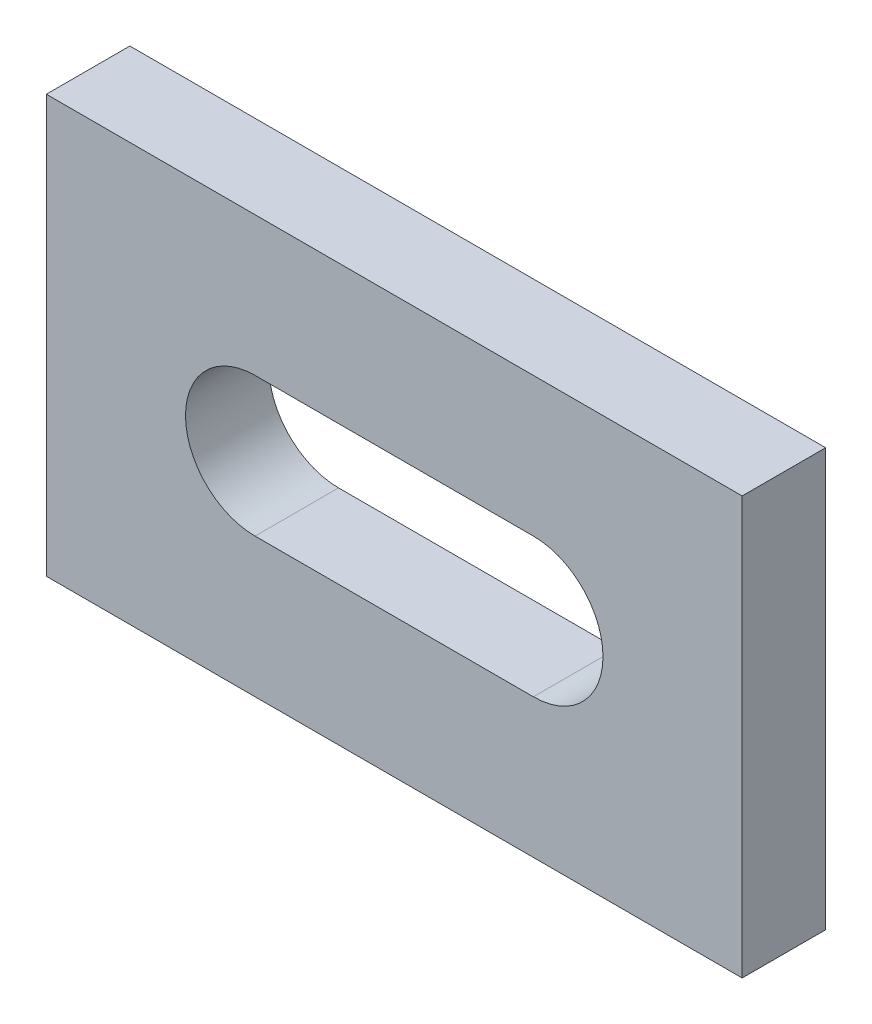
ISO-10303-21;
HEADER;
FILE_DESCRIPTION(('STEP AP214'),'2;1');
FILE_NAME('part.step','',(''),(''),'','','');
FILE_SCHEMA(('AUTOMOTIVE_DESIGN { 1 0 10303 214 1 1 1 1 }'));
ENDSEC;
DATA;
#1=APPLICATION_CONTEXT('core data for automotive mechanical design processes');
#2=APPLICATION_PROTOCOL_DEFINITION('international standard','automotive_design',2000,#1);
#3=PRODUCT_CONTEXT('',#1,'mechanical');
#4=PRODUCT('Part','Part','',(#3));
#5=PRODUCT_RELATED_PRODUCT_CATEGORY('part','',(#4));
#6=PRODUCT_DEFINITION_FORMATION('','',#4);
#7=PRODUCT_DEFINITION_CONTEXT('part definition',#1,'design');
#8=PRODUCT_DEFINITION('design','',#6,#7);
#9=PRODUCT_DEFINITION_SHAPE('','',#8);
#10=(LENGTH_UNIT() NAMED_UNIT(*) SI_UNIT(.MILLI.,.METRE.));
#11=(NAMED_UNIT(*) PLANE_ANGLE_UNIT() SI_UNIT($,.RADIAN.));
#12=(NAMED_UNIT(*) SI_UNIT($,.STERADIAN.) SOLID_ANGLE_UNIT());
#13=UNCERTAINTY_MEASURE_WITH_UNIT(LENGTH_MEASURE(1.E-05),#10,'distance_accuracy_value','');
#14=(GEOMETRIC_REPRESENTATION_CONTEXT(3) GLOBAL_UNCERTAINTY_ASSIGNED_CONTEXT((#13)) GLOBAL_UNIT_ASSIGNED_CONTEXT((#10,
#11,#12)) REPRESENTATION_CONTEXT('',''));
#15=CARTESIAN_POINT('',(0.,0.,0.));
#16=DIRECTION('',(0.,0.,1.));
#17=DIRECTION('',(1.,0.,0.));
#18=AXIS2_PLACEMENT_3D('',#15,#16,#17);
#19=CARTESIAN_POINT('',(0.,0.,18.));
#20=DIRECTION('',(0.,0.,-1.));
#21=DIRECTION('',(-1.,0.,0.));
#22=AXIS2_PLACEMENT_3D('',#19,#20,#21);
#23=PLANE('',#22);
#24=DIRECTION('',(0.,-1.,0.));
#25=VECTOR('',#24,1.);
#26=CARTESIAN_POINT('',(0.,0.,18.));
#27=LINE('',#26,#25);
#28=CARTESIAN_POINT('',(0.,90.,18.));
#29=VERTEX_POINT('',#28);
#30=CARTESIAN_POINT('',(0.,0.,18.));
#31=VERTEX_POINT('',#30);
#32=EDGE_CURVE('E144',#29,#31,#27,.T.);
#33=ORIENTED_EDGE('',*,*,#32,.T.);
#34=DIRECTION('',(1.,0.,0.));
#35=VECTOR('',#34,1.);
#36=CARTESIAN_POINT('',(0.,0.,18.));
#37=LINE('',#36,#35);
#38=CARTESIAN_POINT('',(150.,0.,18.));
#39=VERTEX_POINT('',#38);
#40=EDGE_CURVE('E147',#31,#39,#37,.T.);
#41=ORIENTED_EDGE('',*,*,#40,.T.);
#42=DIRECTION('',(0.,1.,0.));
#43=VECTOR('',#42,1.);
#44=CARTESIAN_POINT('',(150.,0.,18.));
#45=LINE('',#44,#43);
#46=CARTESIAN_POINT('',(150.,90.,18.));
#47=VERTEX_POINT('',#46);
#48=EDGE_CURVE('E150',#39,#47,#45,.T.);
#49=ORIENTED_EDGE('',*,*,#48,.T.);
#50=DIRECTION('',(-1.,0.,0.));
#51=VECTOR('',#50,1.);
#52=CARTESIAN_POINT('',(0.,90.,18.));
#53=LINE('',#52,#51);
#54=EDGE_CURVE('E152',#47,#29,#53,.T.);
#55=ORIENTED_EDGE('',*,*,#54,.T.);
#56=EDGE_LOOP('',(#33,#41,#49,#55));
#57=FACE_BOUND('',#56,.T.);
#58=CARTESIAN_POINT('',(105.,45.,18.));
#59=DIRECTION('',(0.,0.,1.));
#60=DIRECTION('',(1.,0.,0.));
#61=AXIS2_PLACEMENT_3D('',#58,#59,#60);
#62=CIRCLE('',#61,15.);
#63=CARTESIAN_POINT('',(105.,30.,18.));
#64=VERTEX_POINT('',#63);
#65=CARTESIAN_POINT('',(105.,60.,18.));
#66=VERTEX_POINT('',#65);
#67=EDGE_CURVE('E108',#64,#66,#62,.T.);
#68=ORIENTED_EDGE('',*,*,#67,.F.);
#69=DIRECTION('',(1.,0.,0.));
#70=VECTOR('',#69,1.);
#71=CARTESIAN_POINT('',(45.,30.,18.));
#72=LINE('',#71,#70);
#73=CARTESIAN_POINT('',(45.,30.,18.));
#74=VERTEX_POINT('',#73);
#75=EDGE_CURVE('E130',#74,#64,#72,.T.);
#76=ORIENTED_EDGE('',*,*,#75,.F.);
#77=CARTESIAN_POINT('',(45.,45.,18.));
#78=DIRECTION('',(0.,0.,1.));
#79=DIRECTION('',(1.,0.,0.));
#80=AXIS2_PLACEMENT_3D('',#77,#78,#79);
#81=CIRCLE('',#80,15.);
#82=CARTESIAN_POINT('',(45.,60.,18.));
#83=VERTEX_POINT('',#82);
#84=EDGE_CURVE('E128',#83,#74,#81,.T.);
#85=ORIENTED_EDGE('',*,*,#84,.F.);
#86=DIRECTION('',(-1.,0.,0.));
#87=VECTOR('',#86,1.);
#88=CARTESIAN_POINT('',(45.,60.,18.));
#89=LINE('',#88,#87);
#90=EDGE_CURVE('E116',#66,#83,#89,.T.);
#91=ORIENTED_EDGE('',*,*,#90,.F.);
#92=EDGE_LOOP('',(#68,#76,#85,#91));
#93=FACE_BOUND('',#92,.T.);
#94=ADVANCED_FACE('F43',(#57,#93),#23,.F.);
#95=CARTESIAN_POINT('',(0.,0.,0.));
#96=DIRECTION('',(0.,0.,-1.));
#97=DIRECTION('',(-1.,0.,0.));
#98=AXIS2_PLACEMENT_3D('',#95,#96,#97);
#99=PLANE('',#98);
#100=DIRECTION('',(0.,-1.,0.));
#101=VECTOR('',#100,1.);
#102=CARTESIAN_POINT('',(0.,0.,0.));
#103=LINE('',#102,#101);
#104=CARTESIAN_POINT('',(0.,90.,0.));
#105=VERTEX_POINT('',#104);
#106=CARTESIAN_POINT('',(0.,0.,0.));
#107=VERTEX_POINT('',#106);
#108=EDGE_CURVE('E124',#105,#107,#103,.T.);
#109=ORIENTED_EDGE('',*,*,#108,.F.);
#110=DIRECTION('',(-1.,0.,0.));
#111=VECTOR('',#110,1.);
#112=CARTESIAN_POINT('',(0.,90.,0.));
#113=LINE('',#112,#111);
#114=CARTESIAN_POINT('',(150.,90.,0.));
#115=VERTEX_POINT('',#114);
#116=EDGE_CURVE('E148',#115,#105,#113,.T.);
#117=ORIENTED_EDGE('',*,*,#116,.F.);
#118=DIRECTION('',(0.,1.,0.));
#119=VECTOR('',#118,1.);
#120=CARTESIAN_POINT('',(150.,0.,0.));
#121=LINE('',#120,#119);
#122=CARTESIAN_POINT('',(150.,0.,0.));
#123=VERTEX_POINT('',#122);
#124=EDGE_CURVE('E159',#123,#115,#121,.T.);
#125=ORIENTED_EDGE('',*,*,#124,.F.);
#126=DIRECTION('',(1.,0.,0.));
#127=VECTOR('',#126,1.);
#128=CARTESIAN_POINT('',(0.,0.,0.));
#129=LINE('',#128,#127);
#130=EDGE_CURVE('E157',#107,#123,#129,.T.);
#131=ORIENTED_EDGE('',*,*,#130,.F.);
#132=EDGE_LOOP('',(#109,#117,#125,#131));
#133=FACE_BOUND('',#132,.T.);
#134=DIRECTION('',(1.,0.,0.));
#135=VECTOR('',#134,1.);
#136=CARTESIAN_POINT('',(45.,30.,0.));
#137=LINE('',#136,#135);
#138=CARTESIAN_POINT('',(45.,30.,0.));
#139=VERTEX_POINT('',#138);
#140=CARTESIAN_POINT('',(105.,30.,0.));
#141=VERTEX_POINT('',#140);
#142=EDGE_CURVE('E117',#139,#141,#137,.T.);
#143=ORIENTED_EDGE('',*,*,#142,.T.);
#144=CARTESIAN_POINT('',(105.,45.,0.));
#145=DIRECTION('',(0.,0.,1.));
#146=DIRECTION('',(1.,0.,0.));
#147=AXIS2_PLACEMENT_3D('',#144,#145,#146);
#148=CIRCLE('',#147,15.);
#149=CARTESIAN_POINT('',(105.,60.,0.));
#150=VERTEX_POINT('',#149);
#151=EDGE_CURVE('E66',#141,#150,#148,.T.);
#152=ORIENTED_EDGE('',*,*,#151,.T.);
#153=DIRECTION('',(-1.,0.,0.));
#154=VECTOR('',#153,1.);
#155=CARTESIAN_POINT('',(45.,60.,0.));
#156=LINE('',#155,#154);
#157=CARTESIAN_POINT('',(45.,60.,0.));
#158=VERTEX_POINT('',#157);
#159=EDGE_CURVE('E123',#150,#158,#156,.T.);
#160=ORIENTED_EDGE('',*,*,#159,.T.);
#161=CARTESIAN_POINT('',(45.,45.,0.));
#162=DIRECTION('',(0.,0.,1.));
#163=DIRECTION('',(1.,0.,0.));
#164=AXIS2_PLACEMENT_3D('',#161,#162,#163);
#165=CIRCLE('',#164,15.);
#166=EDGE_CURVE('E136',#158,#139,#165,.T.);
#167=ORIENTED_EDGE('',*,*,#166,.T.);
#168=EDGE_LOOP('',(#143,#152,#160,#167));
#169=FACE_BOUND('',#168,.T.);
#170=ADVANCED_FACE('F177',(#133,#169),#99,.T.);
#171=CARTESIAN_POINT('',(0.,0.,18.));
#172=DIRECTION('',(1.,0.,0.));
#173=DIRECTION('',(0.,0.,-1.));
#174=AXIS2_PLACEMENT_3D('',#171,#172,#173);
#175=PLANE('',#174);
#176=ORIENTED_EDGE('',*,*,#108,.T.);
#177=DIRECTION('',(0.,0.,-1.));
#178=VECTOR('',#177,1.);
#179=CARTESIAN_POINT('',(0.,0.,18.));
#180=LINE('',#179,#178);
#181=EDGE_CURVE('E11',#31,#107,#180,.T.);
#182=ORIENTED_EDGE('',*,*,#181,.F.);
#183=ORIENTED_EDGE('',*,*,#32,.F.);
#184=DIRECTION('',(0.,0.,-1.));
#185=VECTOR('',#184,1.);
#186=CARTESIAN_POINT('',(0.,90.,18.));
#187=LINE('',#186,#185);
#188=EDGE_CURVE('E154',#29,#105,#187,.T.);
#189=ORIENTED_EDGE('',*,*,#188,.T.);
#190=EDGE_LOOP('',(#176,#182,#183,#189));
#191=FACE_BOUND('',#190,.T.);
#192=ADVANCED_FACE('F45',(#191),#175,.F.);
#193=CARTESIAN_POINT('',(0.,0.,18.));
#194=DIRECTION('',(0.,1.,0.));
#195=DIRECTION('',(0.,0.,1.));
#196=AXIS2_PLACEMENT_3D('',#193,#194,#195);
#197=PLANE('',#196);
#198=ORIENTED_EDGE('',*,*,#130,.T.);
#199=DIRECTION('',(0.,0.,-1.));
#200=VECTOR('',#199,1.);
#201=CARTESIAN_POINT('',(150.,0.,18.));
#202=LINE('',#201,#200);
#203=EDGE_CURVE('E51',#39,#123,#202,.T.);
#204=ORIENTED_EDGE('',*,*,#203,.F.);
#205=ORIENTED_EDGE('',*,*,#40,.F.);
#206=ORIENTED_EDGE('',*,*,#181,.T.);
#207=EDGE_LOOP('',(#198,#204,#205,#206));
#208=FACE_BOUND('',#207,.T.);
#209=ADVANCED_FACE('F187',(#208),#197,.F.);
#210=CARTESIAN_POINT('',(150.,0.,18.));
#211=DIRECTION('',(-1.,0.,0.));
#212=DIRECTION('',(0.,0.,1.));
#213=AXIS2_PLACEMENT_3D('',#210,#211,#212);
#214=PLANE('',#213);
#215=ORIENTED_EDGE('',*,*,#124,.T.);
#216=DIRECTION('',(0.,0.,-1.));
#217=VECTOR('',#216,1.);
#218=CARTESIAN_POINT('',(150.,90.,18.));
#219=LINE('',#218,#217);
#220=EDGE_CURVE('E164',#47,#115,#219,.T.);
#221=ORIENTED_EDGE('',*,*,#220,.F.);
#222=ORIENTED_EDGE('',*,*,#48,.F.);
#223=ORIENTED_EDGE('',*,*,#203,.T.);
#224=EDGE_LOOP('',(#215,#221,#222,#223));
#225=FACE_BOUND('',#224,.T.);
#226=ADVANCED_FACE('F171',(#225),#214,.F.);
#227=CARTESIAN_POINT('',(0.,90.,18.));
#228=DIRECTION('',(0.,-1.,0.));
#229=DIRECTION('',(0.,0.,-1.));
#230=AXIS2_PLACEMENT_3D('',#227,#228,#229);
#231=PLANE('',#230);
#232=ORIENTED_EDGE('',*,*,#116,.T.);
#233=ORIENTED_EDGE('',*,*,#188,.F.);
#234=ORIENTED_EDGE('',*,*,#54,.F.);
#235=ORIENTED_EDGE('',*,*,#220,.T.);
#236=EDGE_LOOP('',(#232,#233,#234,#235));
#237=FACE_BOUND('',#236,.T.);
#238=ADVANCED_FACE('F181',(#237),#231,.F.);
#239=CARTESIAN_POINT('',(105.,45.,18.));
#240=DIRECTION('',(0.,0.,-1.));
#241=DIRECTION('',(-1.,0.,0.));
#242=AXIS2_PLACEMENT_3D('',#239,#240,#241);
#243=CYLINDRICAL_SURFACE('',#242,15.);
#244=ORIENTED_EDGE('',*,*,#151,.F.);
#245=DIRECTION('',(0.,0.,-1.));
#246=VECTOR('',#245,1.);
#247=CARTESIAN_POINT('',(105.,30.,18.));
#248=LINE('',#247,#246);
#249=EDGE_CURVE('E112',#64,#141,#248,.T.);
#250=ORIENTED_EDGE('',*,*,#249,.F.);
#251=ORIENTED_EDGE('',*,*,#67,.T.);
#252=DIRECTION('',(0.,0.,-1.));
#253=VECTOR('',#252,1.);
#254=CARTESIAN_POINT('',(105.,60.,18.));
#255=LINE('',#254,#253);
#256=EDGE_CURVE('E111',#66,#150,#255,.T.);
#257=ORIENTED_EDGE('',*,*,#256,.T.);
#258=EDGE_LOOP('',(#244,#250,#251,#257));
#259=FACE_BOUND('',#258,.T.);
#260=ADVANCED_FACE('F110',(#259),#243,.F.);
#261=CARTESIAN_POINT('',(45.,60.,18.));
#262=DIRECTION('',(0.,-1.,0.));
#263=DIRECTION('',(0.,0.,-1.));
#264=AXIS2_PLACEMENT_3D('',#261,#262,#263);
#265=PLANE('',#264);
#266=ORIENTED_EDGE('',*,*,#159,.F.);
#267=ORIENTED_EDGE('',*,*,#256,.F.);
#268=ORIENTED_EDGE('',*,*,#90,.T.);
#269=DIRECTION('',(0.,0.,-1.));
#270=VECTOR('',#269,1.);
#271=CARTESIAN_POINT('',(45.,60.,18.));
#272=LINE('',#271,#270);
#273=EDGE_CURVE('E125',#83,#158,#272,.T.);
#274=ORIENTED_EDGE('',*,*,#273,.T.);
#275=EDGE_LOOP('',(#266,#267,#268,#274));
#276=FACE_BOUND('',#275,.T.);
#277=ADVANCED_FACE('F120',(#276),#265,.T.);
#278=CARTESIAN_POINT('',(45.,45.,18.));
#279=DIRECTION('',(0.,0.,-1.));
#280=DIRECTION('',(-1.,0.,0.));
#281=AXIS2_PLACEMENT_3D('',#278,#279,#280);
#282=CYLINDRICAL_SURFACE('',#281,15.);
#283=ORIENTED_EDGE('',*,*,#166,.F.);
#284=ORIENTED_EDGE('',*,*,#273,.F.);
#285=ORIENTED_EDGE('',*,*,#84,.T.);
#286=DIRECTION('',(0.,0.,-1.));
#287=VECTOR('',#286,1.);
#288=CARTESIAN_POINT('',(45.,30.,18.));
#289=LINE('',#288,#287);
#290=EDGE_CURVE('E58',#74,#139,#289,.T.);
#291=ORIENTED_EDGE('',*,*,#290,.T.);
#292=EDGE_LOOP('',(#283,#284,#285,#291));
#293=FACE_BOUND('',#292,.T.);
#294=ADVANCED_FACE('F210',(#293),#282,.F.);
#295=CARTESIAN_POINT('',(45.,30.,18.));
#296=DIRECTION('',(0.,1.,0.));
#297=DIRECTION('',(0.,0.,1.));
#298=AXIS2_PLACEMENT_3D('',#295,#296,#297);
#299=PLANE('',#298);
#300=ORIENTED_EDGE('',*,*,#142,.F.);
#301=ORIENTED_EDGE('',*,*,#290,.F.);
#302=ORIENTED_EDGE('',*,*,#75,.T.);
#303=ORIENTED_EDGE('',*,*,#249,.T.);
#304=EDGE_LOOP('',(#300,#301,#302,#303));
#305=FACE_BOUND('',#304,.T.);
#306=ADVANCED_FACE('F214',(#305),#299,.T.);
#307=CLOSED_SHELL('',(#94,#170,#192,#209,#226,#238,#260,#277,#294,#306));
#308=MANIFOLD_SOLID_BREP('B2',#307);
#309=ADVANCED_BREP_SHAPE_REPRESENTATION('',(#18,#308),#14);
#310=SHAPE_DEFINITION_REPRESENTATION(#9,#309);
ENDSEC;
END-ISO-10303-21;
